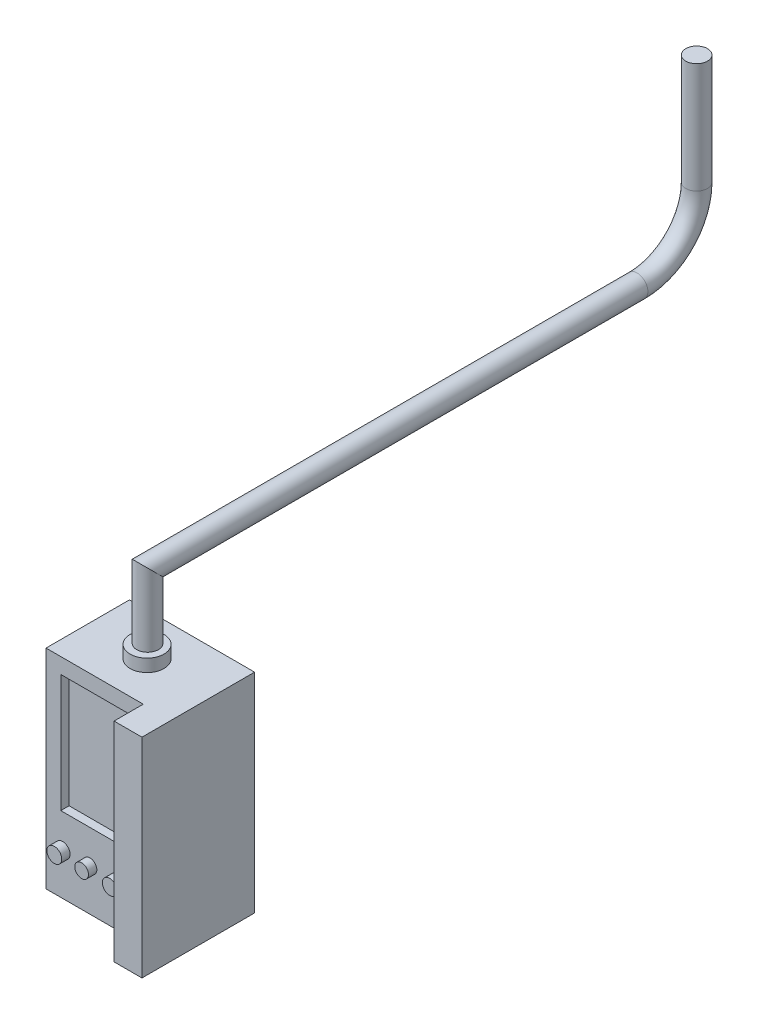
ISO-10303-21;
HEADER;
FILE_DESCRIPTION(('STEP AP214'),'2;1');
FILE_NAME('part.step','',(''),(''),'','','');
FILE_SCHEMA(('AUTOMOTIVE_DESIGN { 1 0 10303 214 1 1 1 1 }'));
ENDSEC;
DATA;
#1=APPLICATION_CONTEXT('core data for automotive mechanical design processes');
#2=APPLICATION_PROTOCOL_DEFINITION('international standard','automotive_design',2000,#1);
#3=PRODUCT_CONTEXT('',#1,'mechanical');
#4=PRODUCT('Part','Part','',(#3));
#5=PRODUCT_RELATED_PRODUCT_CATEGORY('part','',(#4));
#6=PRODUCT_DEFINITION_FORMATION('','',#4);
#7=PRODUCT_DEFINITION_CONTEXT('part definition',#1,'design');
#8=PRODUCT_DEFINITION('design','',#6,#7);
#9=PRODUCT_DEFINITION_SHAPE('','',#8);
#10=(LENGTH_UNIT() NAMED_UNIT(*) SI_UNIT(.MILLI.,.METRE.));
#11=(NAMED_UNIT(*) PLANE_ANGLE_UNIT() SI_UNIT($,.RADIAN.));
#12=(NAMED_UNIT(*) SI_UNIT($,.STERADIAN.) SOLID_ANGLE_UNIT());
#13=UNCERTAINTY_MEASURE_WITH_UNIT(LENGTH_MEASURE(1.E-05),#10,'distance_accuracy_value','');
#14=(GEOMETRIC_REPRESENTATION_CONTEXT(3) GLOBAL_UNCERTAINTY_ASSIGNED_CONTEXT((#13)) GLOBAL_UNIT_ASSIGNED_CONTEXT((#10,
#11,#12)) REPRESENTATION_CONTEXT('',''));
#15=CARTESIAN_POINT('',(0.,0.,0.));
#16=DIRECTION('',(0.,0.,1.));
#17=DIRECTION('',(1.,0.,0.));
#18=AXIS2_PLACEMENT_3D('',#15,#16,#17);
#19=CARTESIAN_POINT('',(-2.79538140352671,33.5591942633084,17.221007175734));
#20=DIRECTION('',(-1.,0.,0.));
#21=DIRECTION('',(0.,-1.,0.));
#22=AXIS2_PLACEMENT_3D('',#19,#20,#21);
#23=PLANE('',#22);
#24=DIRECTION('',(0.,1.,0.));
#25=VECTOR('',#24,1.);
#26=CARTESIAN_POINT('',(-2.79538140352671,33.5591942633084,3.22100717573399));
#27=LINE('',#26,#25);
#28=CARTESIAN_POINT('',(-2.7953814035267,-1.44080573669158,3.22100717573399));
#29=VERTEX_POINT('',#28);
#30=CARTESIAN_POINT('',(-2.79538140352671,33.5591942633084,3.22100717573399));
#31=VERTEX_POINT('',#30);
#32=EDGE_CURVE('E174',#29,#31,#27,.T.);
#33=ORIENTED_EDGE('',*,*,#32,.T.);
#34=DIRECTION('',(0.,0.,-1.));
#35=VECTOR('',#34,1.);
#36=CARTESIAN_POINT('',(-2.79538140352671,33.5591942633084,17.221007175734));
#37=LINE('',#36,#35);
#38=CARTESIAN_POINT('',(-2.79538140352671,33.5591942633084,22.121007175734));
#39=VERTEX_POINT('',#38);
#40=EDGE_CURVE('E46',#39,#31,#37,.T.);
#41=ORIENTED_EDGE('',*,*,#40,.F.);
#42=DIRECTION('',(0.,1.,0.));
#43=VECTOR('',#42,1.);
#44=CARTESIAN_POINT('',(-2.7953814035267,4.80488959279782,22.121007175734));
#45=LINE('',#44,#43);
#46=CARTESIAN_POINT('',(-2.7953814035267,-1.44080573669158,22.121007175734));
#47=VERTEX_POINT('',#46);
#48=EDGE_CURVE('E138',#47,#39,#45,.T.);
#49=ORIENTED_EDGE('',*,*,#48,.F.);
#50=DIRECTION('',(0.,0.,-1.));
#51=VECTOR('',#50,1.);
#52=CARTESIAN_POINT('',(-2.7953814035267,-1.44080573669158,17.221007175734));
#53=LINE('',#52,#51);
#54=EDGE_CURVE('E186',#47,#29,#53,.T.);
#55=ORIENTED_EDGE('',*,*,#54,.T.);
#56=EDGE_LOOP('',(#33,#41,#49,#55));
#57=FACE_BOUND('',#56,.T.);
#58=ADVANCED_FACE('F43',(#57),#23,.F.);
#59=CARTESIAN_POINT('',(-23.7953814035267,33.5591942633084,17.221007175734));
#60=DIRECTION('',(0.,-1.,0.));
#61=DIRECTION('',(0.,0.,-1.));
#62=AXIS2_PLACEMENT_3D('',#59,#60,#61);
#63=PLANE('',#62);
#64=CARTESIAN_POINT('',(-13.767048859401,33.5591942633084,10.2981586443497));
#65=DIRECTION('',(0.,1.,0.));
#66=DIRECTION('',(0.,0.,1.));
#67=AXIS2_PLACEMENT_3D('',#64,#65,#66);
#68=CIRCLE('',#67,2.85205853885435);
#69=CARTESIAN_POINT('',(-13.767048859401,33.5591942633084,13.1502171832041));
#70=VERTEX_POINT('',#69);
#71=EDGE_CURVE('E51',#70,#70,#68,.T.);
#72=ORIENTED_EDGE('',*,*,#71,.F.);
#73=EDGE_LOOP('',(#72));
#74=FACE_BOUND('',#73,.T.);
#75=DIRECTION('',(-1.,0.,0.));
#76=VECTOR('',#75,1.);
#77=CARTESIAN_POINT('',(-23.7953814035267,33.5591942633084,3.22100717573399));
#78=LINE('',#77,#76);
#79=CARTESIAN_POINT('',(-23.7953814035267,33.5591942633084,3.22100717573399));
#80=VERTEX_POINT('',#79);
#81=EDGE_CURVE('E189',#31,#80,#78,.T.);
#82=ORIENTED_EDGE('',*,*,#81,.T.);
#83=DIRECTION('',(0.,0.,-1.));
#84=VECTOR('',#83,1.);
#85=CARTESIAN_POINT('',(-23.7953814035267,33.5591942633084,17.221007175734));
#86=LINE('',#85,#84);
#87=CARTESIAN_POINT('',(-23.7953814035267,33.5591942633084,17.221007175734));
#88=VERTEX_POINT('',#87);
#89=EDGE_CURVE('E198',#88,#80,#86,.T.);
#90=ORIENTED_EDGE('',*,*,#89,.F.);
#91=DIRECTION('',(-1.,0.,0.));
#92=VECTOR('',#91,1.);
#93=CARTESIAN_POINT('',(-23.7953814035267,33.5591942633084,17.221007175734));
#94=LINE('',#93,#92);
#95=CARTESIAN_POINT('',(-7.47893601776985,33.5591942633084,17.221007175734));
#96=VERTEX_POINT('',#95);
#97=EDGE_CURVE('E144',#96,#88,#94,.T.);
#98=ORIENTED_EDGE('',*,*,#97,.F.);
#99=DIRECTION('',(0.,0.,-1.));
#100=VECTOR('',#99,1.);
#101=CARTESIAN_POINT('',(-7.47893601776985,33.5591942633084,22.121007175734));
#102=LINE('',#101,#100);
#103=CARTESIAN_POINT('',(-7.47893601776985,33.5591942633084,22.121007175734));
#104=VERTEX_POINT('',#103);
#105=EDGE_CURVE('E125',#104,#96,#102,.T.);
#106=ORIENTED_EDGE('',*,*,#105,.F.);
#107=DIRECTION('',(-1.,0.,0.));
#108=VECTOR('',#107,1.);
#109=CARTESIAN_POINT('',(-3.79246272769597,33.5591942633084,22.121007175734));
#110=LINE('',#109,#108);
#111=EDGE_CURVE('E132',#39,#104,#110,.T.);
#112=ORIENTED_EDGE('',*,*,#111,.F.);
#113=ORIENTED_EDGE('',*,*,#40,.T.);
#114=EDGE_LOOP('',(#82,#90,#98,#106,#112,#113));
#115=FACE_BOUND('',#114,.T.);
#116=ADVANCED_FACE('F142',(#74,#115),#63,.F.);
#117=CARTESIAN_POINT('',(-23.7953814035267,33.5591942633084,17.221007175734));
#118=DIRECTION('',(1.,0.,0.));
#119=DIRECTION('',(0.,1.,0.));
#120=AXIS2_PLACEMENT_3D('',#117,#118,#119);
#121=PLANE('',#120);
#122=DIRECTION('',(0.,-1.,0.));
#123=VECTOR('',#122,1.);
#124=CARTESIAN_POINT('',(-23.7953814035267,33.5591942633084,3.22100717573399));
#125=LINE('',#124,#123);
#126=CARTESIAN_POINT('',(-23.7953814035267,-1.44080573669158,3.22100717573399));
#127=VERTEX_POINT('',#126);
#128=EDGE_CURVE('E191',#80,#127,#125,.T.);
#129=ORIENTED_EDGE('',*,*,#128,.T.);
#130=DIRECTION('',(0.,0.,-1.));
#131=VECTOR('',#130,1.);
#132=CARTESIAN_POINT('',(-23.7953814035267,-1.44080573669158,17.221007175734));
#133=LINE('',#132,#131);
#134=CARTESIAN_POINT('',(-23.7953814035267,-1.44080573669158,17.221007175734));
#135=VERTEX_POINT('',#134);
#136=EDGE_CURVE('E196',#135,#127,#133,.T.);
#137=ORIENTED_EDGE('',*,*,#136,.F.);
#138=DIRECTION('',(0.,-1.,0.));
#139=VECTOR('',#138,1.);
#140=CARTESIAN_POINT('',(-23.7953814035267,33.5591942633084,17.221007175734));
#141=LINE('',#140,#139);
#142=EDGE_CURVE('E181',#88,#135,#141,.T.);
#143=ORIENTED_EDGE('',*,*,#142,.F.);
#144=ORIENTED_EDGE('',*,*,#89,.T.);
#145=EDGE_LOOP('',(#129,#137,#143,#144));
#146=FACE_BOUND('',#145,.T.);
#147=ADVANCED_FACE('F238',(#146),#121,.F.);
#148=CARTESIAN_POINT('',(-23.7953814035267,-1.44080573669158,17.221007175734));
#149=DIRECTION('',(0.,1.,0.));
#150=DIRECTION('',(0.,0.,1.));
#151=AXIS2_PLACEMENT_3D('',#148,#149,#150);
#152=PLANE('',#151);
#153=DIRECTION('',(1.,0.,0.));
#154=VECTOR('',#153,1.);
#155=CARTESIAN_POINT('',(-23.7953814035267,-1.44080573669158,3.22100717573399));
#156=LINE('',#155,#154);
#157=EDGE_CURVE('E182',#127,#29,#156,.T.);
#158=ORIENTED_EDGE('',*,*,#157,.T.);
#159=ORIENTED_EDGE('',*,*,#54,.F.);
#160=DIRECTION('',(1.,0.,0.));
#161=VECTOR('',#160,1.);
#162=CARTESIAN_POINT('',(-3.79246272769597,-1.44080573669158,22.121007175734));
#163=LINE('',#162,#161);
#164=CARTESIAN_POINT('',(-7.47893601776985,-1.44080573669158,22.121007175734));
#165=VERTEX_POINT('',#164);
#166=EDGE_CURVE('E131',#165,#47,#163,.T.);
#167=ORIENTED_EDGE('',*,*,#166,.F.);
#168=DIRECTION('',(0.,0.,-1.));
#169=VECTOR('',#168,1.);
#170=CARTESIAN_POINT('',(-7.47893601776985,-1.44080573669158,22.121007175734));
#171=LINE('',#170,#169);
#172=CARTESIAN_POINT('',(-7.47893601776985,-1.44080573669158,17.221007175734));
#173=VERTEX_POINT('',#172);
#174=EDGE_CURVE('E127',#165,#173,#171,.T.);
#175=ORIENTED_EDGE('',*,*,#174,.T.);
#176=DIRECTION('',(1.,0.,0.));
#177=VECTOR('',#176,1.);
#178=CARTESIAN_POINT('',(-23.7953814035267,-1.44080573669158,17.221007175734));
#179=LINE('',#178,#177);
#180=EDGE_CURVE('E184',#135,#173,#179,.T.);
#181=ORIENTED_EDGE('',*,*,#180,.F.);
#182=ORIENTED_EDGE('',*,*,#136,.T.);
#183=EDGE_LOOP('',(#158,#159,#167,#175,#181,#182));
#184=FACE_BOUND('',#183,.T.);
#185=ADVANCED_FACE('F231',(#184),#152,.F.);
#186=CARTESIAN_POINT('',(-3.79246272769597,4.80488959279782,17.221007175734));
#187=DIRECTION('',(0.,0.,1.));
#188=DIRECTION('',(1.,0.,0.));
#189=AXIS2_PLACEMENT_3D('',#186,#187,#188);
#190=PLANE('',#189);
#191=CARTESIAN_POINT('',(-11.696623683679,5.59515293267952,17.221007175734));
#192=DIRECTION('',(0.,0.,1.));
#193=DIRECTION('',(1.,0.,0.));
#194=AXIS2_PLACEMENT_3D('',#191,#192,#193);
#195=CIRCLE('',#194,1.2472440046638);
#196=CARTESIAN_POINT('',(-10.4493796790152,5.59515293267952,17.221007175734));
#197=VERTEX_POINT('',#196);
#198=EDGE_CURVE('E214',#197,#197,#195,.T.);
#199=ORIENTED_EDGE('',*,*,#198,.F.);
#200=EDGE_LOOP('',(#199));
#201=FACE_BOUND('',#200,.T.);
#202=CARTESIAN_POINT('',(-16.4216101494022,5.59515293267952,17.221007175734));
#203=DIRECTION('',(0.,0.,1.));
#204=DIRECTION('',(1.,0.,0.));
#205=AXIS2_PLACEMENT_3D('',#202,#203,#204);
#206=CIRCLE('',#205,1.15096971644149);
#207=CARTESIAN_POINT('',(-15.2706404329607,5.59515293267952,17.221007175734));
#208=VERTEX_POINT('',#207);
#209=EDGE_CURVE('E213',#208,#208,#206,.T.);
#210=ORIENTED_EDGE('',*,*,#209,.F.);
#211=EDGE_LOOP('',(#210));
#212=FACE_BOUND('',#211,.T.);
#213=CARTESIAN_POINT('',(-21.0064010664818,5.59515293267952,17.221007175734));
#214=DIRECTION('',(0.,0.,1.));
#215=DIRECTION('',(1.,0.,0.));
#216=AXIS2_PLACEMENT_3D('',#213,#214,#215);
#217=CIRCLE('',#216,1.24837859010856);
#218=CARTESIAN_POINT('',(-19.7580224763732,5.59515293267952,17.221007175734));
#219=VERTEX_POINT('',#218);
#220=EDGE_CURVE('E220',#219,#219,#217,.T.);
#221=ORIENTED_EDGE('',*,*,#220,.F.);
#222=EDGE_LOOP('',(#221));
#223=FACE_BOUND('',#222,.T.);
#224=DIRECTION('',(0.,-1.,0.));
#225=VECTOR('',#224,1.);
#226=CARTESIAN_POINT('',(-7.47893601776985,4.80488959279782,17.221007175734));
#227=LINE('',#226,#225);
#228=EDGE_CURVE('E59',#96,#173,#227,.T.);
#229=ORIENTED_EDGE('',*,*,#228,.F.);
#230=ORIENTED_EDGE('',*,*,#97,.T.);
#231=ORIENTED_EDGE('',*,*,#142,.T.);
#232=ORIENTED_EDGE('',*,*,#180,.T.);
#233=EDGE_LOOP('',(#229,#230,#231,#232));
#234=FACE_BOUND('',#233,.T.);
#235=DIRECTION('',(0.,1.,0.));
#236=VECTOR('',#235,1.);
#237=CARTESIAN_POINT('',(-9.00569416506817,30.9619212226339,17.221007175734));
#238=LINE('',#237,#236);
#239=CARTESIAN_POINT('',(-9.00569416506817,11.171513915197,17.221007175734));
#240=VERTEX_POINT('',#239);
#241=CARTESIAN_POINT('',(-9.00569416506817,30.9619212226339,17.221007175734));
#242=VERTEX_POINT('',#241);
#243=EDGE_CURVE('E67',#240,#242,#238,.T.);
#244=ORIENTED_EDGE('',*,*,#243,.F.);
#245=DIRECTION('',(1.,0.,0.));
#246=VECTOR('',#245,1.);
#247=CARTESIAN_POINT('',(-21.3188164589605,11.171513915197,17.221007175734));
#248=LINE('',#247,#246);
#249=CARTESIAN_POINT('',(-21.3188164589605,11.171513915197,17.221007175734));
#250=VERTEX_POINT('',#249);
#251=EDGE_CURVE('E155',#250,#240,#248,.T.);
#252=ORIENTED_EDGE('',*,*,#251,.F.);
#253=DIRECTION('',(0.,-1.,0.));
#254=VECTOR('',#253,1.);
#255=CARTESIAN_POINT('',(-21.3188164589605,30.9619212226339,17.221007175734));
#256=LINE('',#255,#254);
#257=CARTESIAN_POINT('',(-21.3188164589605,30.9619212226339,17.221007175734));
#258=VERTEX_POINT('',#257);
#259=EDGE_CURVE('E167',#258,#250,#256,.T.);
#260=ORIENTED_EDGE('',*,*,#259,.F.);
#261=DIRECTION('',(-1.,0.,0.));
#262=VECTOR('',#261,1.);
#263=CARTESIAN_POINT('',(-21.3188164589605,30.9619212226339,17.221007175734));
#264=LINE('',#263,#262);
#265=EDGE_CURVE('E146',#242,#258,#264,.T.);
#266=ORIENTED_EDGE('',*,*,#265,.F.);
#267=EDGE_LOOP('',(#244,#252,#260,#266));
#268=FACE_BOUND('',#267,.T.);
#269=ADVANCED_FACE('F239',(#201,#212,#223,#234,#268),#190,.T.);
#270=CARTESIAN_POINT('',(-3.79246272769597,4.80488959279782,3.22100717573399));
#271=DIRECTION('',(0.,0.,1.));
#272=DIRECTION('',(1.,0.,0.));
#273=AXIS2_PLACEMENT_3D('',#270,#271,#272);
#274=PLANE('',#273);
#275=ORIENTED_EDGE('',*,*,#32,.F.);
#276=ORIENTED_EDGE('',*,*,#157,.F.);
#277=ORIENTED_EDGE('',*,*,#128,.F.);
#278=ORIENTED_EDGE('',*,*,#81,.F.);
#279=EDGE_LOOP('',(#275,#276,#277,#278));
#280=FACE_BOUND('',#279,.T.);
#281=ADVANCED_FACE('F236',(#280),#274,.F.);
#282=CARTESIAN_POINT('',(-9.00569416506817,30.9619212226339,15.821007175734));
#283=DIRECTION('',(1.,0.,0.));
#284=DIRECTION('',(0.,0.,-1.));
#285=AXIS2_PLACEMENT_3D('',#282,#283,#284);
#286=PLANE('',#285);
#287=ORIENTED_EDGE('',*,*,#243,.T.);
#288=DIRECTION('',(0.,0.,1.));
#289=VECTOR('',#288,1.);
#290=CARTESIAN_POINT('',(-9.00569416506817,30.9619212226339,15.821007175734));
#291=LINE('',#290,#289);
#292=CARTESIAN_POINT('',(-9.00569416506817,30.9619212226339,15.821007175734));
#293=VERTEX_POINT('',#292);
#294=EDGE_CURVE('E163',#293,#242,#291,.T.);
#295=ORIENTED_EDGE('',*,*,#294,.F.);
#296=DIRECTION('',(0.,1.,0.));
#297=VECTOR('',#296,1.);
#298=CARTESIAN_POINT('',(-9.00569416506817,30.9619212226339,15.821007175734));
#299=LINE('',#298,#297);
#300=CARTESIAN_POINT('',(-9.00569416506817,11.171513915197,15.821007175734));
#301=VERTEX_POINT('',#300);
#302=EDGE_CURVE('E151',#301,#293,#299,.T.);
#303=ORIENTED_EDGE('',*,*,#302,.F.);
#304=DIRECTION('',(0.,0.,1.));
#305=VECTOR('',#304,1.);
#306=CARTESIAN_POINT('',(-9.00569416506817,11.171513915197,15.821007175734));
#307=LINE('',#306,#305);
#308=EDGE_CURVE('E172',#301,#240,#307,.T.);
#309=ORIENTED_EDGE('',*,*,#308,.T.);
#310=EDGE_LOOP('',(#287,#295,#303,#309));
#311=FACE_BOUND('',#310,.T.);
#312=ADVANCED_FACE('F252',(#311),#286,.F.);
#313=CARTESIAN_POINT('',(-21.3188164589605,11.171513915197,15.821007175734));
#314=DIRECTION('',(0.,-1.,0.));
#315=DIRECTION('',(0.,0.,-1.));
#316=AXIS2_PLACEMENT_3D('',#313,#314,#315);
#317=PLANE('',#316);
#318=ORIENTED_EDGE('',*,*,#251,.T.);
#319=ORIENTED_EDGE('',*,*,#308,.F.);
#320=DIRECTION('',(1.,0.,0.));
#321=VECTOR('',#320,1.);
#322=CARTESIAN_POINT('',(-21.3188164589605,11.171513915197,15.821007175734));
#323=LINE('',#322,#321);
#324=CARTESIAN_POINT('',(-21.3188164589605,11.171513915197,15.821007175734));
#325=VERTEX_POINT('',#324);
#326=EDGE_CURVE('E161',#325,#301,#323,.T.);
#327=ORIENTED_EDGE('',*,*,#326,.F.);
#328=DIRECTION('',(0.,0.,1.));
#329=VECTOR('',#328,1.);
#330=CARTESIAN_POINT('',(-21.3188164589605,11.171513915197,15.821007175734));
#331=LINE('',#330,#329);
#332=EDGE_CURVE('E175',#325,#250,#331,.T.);
#333=ORIENTED_EDGE('',*,*,#332,.T.);
#334=EDGE_LOOP('',(#318,#319,#327,#333));
#335=FACE_BOUND('',#334,.T.);
#336=ADVANCED_FACE('F257',(#335),#317,.F.);
#337=CARTESIAN_POINT('',(-21.3188164589605,30.9619212226339,15.821007175734));
#338=DIRECTION('',(-1.,0.,0.));
#339=DIRECTION('',(0.,0.,1.));
#340=AXIS2_PLACEMENT_3D('',#337,#338,#339);
#341=PLANE('',#340);
#342=ORIENTED_EDGE('',*,*,#259,.T.);
#343=ORIENTED_EDGE('',*,*,#332,.F.);
#344=DIRECTION('',(0.,-1.,0.));
#345=VECTOR('',#344,1.);
#346=CARTESIAN_POINT('',(-21.3188164589605,30.9619212226339,15.821007175734));
#347=LINE('',#346,#345);
#348=CARTESIAN_POINT('',(-21.3188164589605,30.9619212226339,15.821007175734));
#349=VERTEX_POINT('',#348);
#350=EDGE_CURVE('E158',#349,#325,#347,.T.);
#351=ORIENTED_EDGE('',*,*,#350,.F.);
#352=DIRECTION('',(0.,0.,1.));
#353=VECTOR('',#352,1.);
#354=CARTESIAN_POINT('',(-21.3188164589605,30.9619212226339,15.821007175734));
#355=LINE('',#354,#353);
#356=EDGE_CURVE('E177',#349,#258,#355,.T.);
#357=ORIENTED_EDGE('',*,*,#356,.T.);
#358=EDGE_LOOP('',(#342,#343,#351,#357));
#359=FACE_BOUND('',#358,.T.);
#360=ADVANCED_FACE('F259',(#359),#341,.F.);
#361=CARTESIAN_POINT('',(-21.3188164589605,30.9619212226339,15.821007175734));
#362=DIRECTION('',(0.,1.,0.));
#363=DIRECTION('',(0.,0.,1.));
#364=AXIS2_PLACEMENT_3D('',#361,#362,#363);
#365=PLANE('',#364);
#366=ORIENTED_EDGE('',*,*,#265,.T.);
#367=ORIENTED_EDGE('',*,*,#356,.F.);
#368=DIRECTION('',(-1.,0.,0.));
#369=VECTOR('',#368,1.);
#370=CARTESIAN_POINT('',(-21.3188164589605,30.9619212226339,15.821007175734));
#371=LINE('',#370,#369);
#372=EDGE_CURVE('E154',#293,#349,#371,.T.);
#373=ORIENTED_EDGE('',*,*,#372,.F.);
#374=ORIENTED_EDGE('',*,*,#294,.T.);
#375=EDGE_LOOP('',(#366,#367,#373,#374));
#376=FACE_BOUND('',#375,.T.);
#377=ADVANCED_FACE('F248',(#376),#365,.F.);
#378=CARTESIAN_POINT('',(-3.79246272769597,4.80488959279782,15.821007175734));
#379=DIRECTION('',(0.,0.,1.));
#380=DIRECTION('',(1.,0.,0.));
#381=AXIS2_PLACEMENT_3D('',#378,#379,#380);
#382=PLANE('',#381);
#383=ORIENTED_EDGE('',*,*,#302,.T.);
#384=ORIENTED_EDGE('',*,*,#372,.T.);
#385=ORIENTED_EDGE('',*,*,#350,.T.);
#386=ORIENTED_EDGE('',*,*,#326,.T.);
#387=EDGE_LOOP('',(#383,#384,#385,#386));
#388=FACE_BOUND('',#387,.T.);
#389=ADVANCED_FACE('F255',(#388),#382,.T.);
#390=CARTESIAN_POINT('',(-7.47893601776985,4.80488959279782,22.121007175734));
#391=DIRECTION('',(1.,0.,0.));
#392=DIRECTION('',(0.,1.,0.));
#393=AXIS2_PLACEMENT_3D('',#390,#391,#392);
#394=PLANE('',#393);
#395=ORIENTED_EDGE('',*,*,#228,.T.);
#396=ORIENTED_EDGE('',*,*,#174,.F.);
#397=DIRECTION('',(0.,-1.,0.));
#398=VECTOR('',#397,1.);
#399=CARTESIAN_POINT('',(-7.47893601776985,4.80488959279782,22.121007175734));
#400=LINE('',#399,#398);
#401=EDGE_CURVE('E121',#104,#165,#400,.T.);
#402=ORIENTED_EDGE('',*,*,#401,.F.);
#403=ORIENTED_EDGE('',*,*,#105,.T.);
#404=EDGE_LOOP('',(#395,#396,#402,#403));
#405=FACE_BOUND('',#404,.T.);
#406=ADVANCED_FACE('F123',(#405),#394,.F.);
#407=CARTESIAN_POINT('',(-3.79246272769597,4.80488959279782,22.121007175734));
#408=DIRECTION('',(0.,0.,1.));
#409=DIRECTION('',(1.,0.,0.));
#410=AXIS2_PLACEMENT_3D('',#407,#408,#409);
#411=PLANE('',#410);
#412=ORIENTED_EDGE('',*,*,#111,.T.);
#413=ORIENTED_EDGE('',*,*,#401,.T.);
#414=ORIENTED_EDGE('',*,*,#166,.T.);
#415=ORIENTED_EDGE('',*,*,#48,.T.);
#416=EDGE_LOOP('',(#412,#413,#414,#415));
#417=FACE_BOUND('',#416,.T.);
#418=ADVANCED_FACE('F136',(#417),#411,.T.);
#419=CARTESIAN_POINT('',(-21.0064010664818,5.59515293267952,18.621007175734));
#420=DIRECTION('',(0.,0.,-1.));
#421=DIRECTION('',(-1.,0.,0.));
#422=AXIS2_PLACEMENT_3D('',#419,#420,#421);
#423=CYLINDRICAL_SURFACE('',#422,1.24837859010856);
#424=CARTESIAN_POINT('',(-21.0064010664818,5.59515293267952,18.621007175734));
#425=DIRECTION('',(0.,0.,1.));
#426=DIRECTION('',(1.,0.,0.));
#427=AXIS2_PLACEMENT_3D('',#424,#425,#426);
#428=CIRCLE('',#427,1.24837859010856);
#429=CARTESIAN_POINT('',(-19.7580224763732,5.59515293267952,18.621007175734));
#430=VERTEX_POINT('',#429);
#431=EDGE_CURVE('E223',#430,#430,#428,.T.);
#432=ORIENTED_EDGE('',*,*,#431,.F.);
#433=EDGE_LOOP('',(#432));
#434=FACE_BOUND('',#433,.T.);
#435=ORIENTED_EDGE('',*,*,#220,.T.);
#436=EDGE_LOOP('',(#435));
#437=FACE_BOUND('',#436,.T.);
#438=ADVANCED_FACE('F328',(#434,#437),#423,.T.);
#439=CARTESIAN_POINT('',(-21.0064010664818,5.59515293267952,18.621007175734));
#440=DIRECTION('',(0.,0.,1.));
#441=DIRECTION('',(1.,0.,0.));
#442=AXIS2_PLACEMENT_3D('',#439,#440,#441);
#443=PLANE('',#442);
#444=ORIENTED_EDGE('',*,*,#431,.T.);
#445=EDGE_LOOP('',(#444));
#446=FACE_BOUND('',#445,.T.);
#447=ADVANCED_FACE('F337',(#446),#443,.T.);
#448=CARTESIAN_POINT('',(-16.4216101494022,5.59515293267952,18.621007175734));
#449=DIRECTION('',(0.,0.,-1.));
#450=DIRECTION('',(-1.,0.,0.));
#451=AXIS2_PLACEMENT_3D('',#448,#449,#450);
#452=CYLINDRICAL_SURFACE('',#451,1.15096971644149);
#453=CARTESIAN_POINT('',(-16.4216101494022,5.59515293267952,18.621007175734));
#454=DIRECTION('',(0.,0.,1.));
#455=DIRECTION('',(1.,0.,0.));
#456=AXIS2_PLACEMENT_3D('',#453,#454,#455);
#457=CIRCLE('',#456,1.15096971644149);
#458=CARTESIAN_POINT('',(-15.2706404329607,5.59515293267952,18.621007175734));
#459=VERTEX_POINT('',#458);
#460=EDGE_CURVE('E217',#459,#459,#457,.T.);
#461=ORIENTED_EDGE('',*,*,#460,.F.);
#462=EDGE_LOOP('',(#461));
#463=FACE_BOUND('',#462,.T.);
#464=ORIENTED_EDGE('',*,*,#209,.T.);
#465=EDGE_LOOP('',(#464));
#466=FACE_BOUND('',#465,.T.);
#467=ADVANCED_FACE('F348',(#463,#466),#452,.T.);
#468=CARTESIAN_POINT('',(-16.4216101494022,5.59515293267952,18.621007175734));
#469=DIRECTION('',(0.,0.,1.));
#470=DIRECTION('',(1.,0.,0.));
#471=AXIS2_PLACEMENT_3D('',#468,#469,#470);
#472=PLANE('',#471);
#473=ORIENTED_EDGE('',*,*,#460,.T.);
#474=EDGE_LOOP('',(#473));
#475=FACE_BOUND('',#474,.T.);
#476=ADVANCED_FACE('F358',(#475),#472,.T.);
#477=CARTESIAN_POINT('',(-11.696623683679,5.59515293267952,18.621007175734));
#478=DIRECTION('',(0.,0.,-1.));
#479=DIRECTION('',(-1.,0.,0.));
#480=AXIS2_PLACEMENT_3D('',#477,#478,#479);
#481=CYLINDRICAL_SURFACE('',#480,1.2472440046638);
#482=CARTESIAN_POINT('',(-11.696623683679,5.59515293267952,18.621007175734));
#483=DIRECTION('',(0.,0.,1.));
#484=DIRECTION('',(1.,0.,0.));
#485=AXIS2_PLACEMENT_3D('',#482,#483,#484);
#486=CIRCLE('',#485,1.2472440046638);
#487=CARTESIAN_POINT('',(-10.4493796790152,5.59515293267952,18.621007175734));
#488=VERTEX_POINT('',#487);
#489=EDGE_CURVE('E210',#488,#488,#486,.T.);
#490=ORIENTED_EDGE('',*,*,#489,.F.);
#491=EDGE_LOOP('',(#490));
#492=FACE_BOUND('',#491,.T.);
#493=ORIENTED_EDGE('',*,*,#198,.T.);
#494=EDGE_LOOP('',(#493));
#495=FACE_BOUND('',#494,.T.);
#496=ADVANCED_FACE('F368',(#492,#495),#481,.T.);
#497=CARTESIAN_POINT('',(-11.696623683679,5.59515293267952,18.621007175734));
#498=DIRECTION('',(0.,0.,1.));
#499=DIRECTION('',(1.,0.,0.));
#500=AXIS2_PLACEMENT_3D('',#497,#498,#499);
#501=PLANE('',#500);
#502=ORIENTED_EDGE('',*,*,#489,.T.);
#503=EDGE_LOOP('',(#502));
#504=FACE_BOUND('',#503,.T.);
#505=ADVANCED_FACE('F377',(#504),#501,.T.);
#506=CARTESIAN_POINT('',(-13.767048859401,35.6591942633084,10.2981586443497));
#507=DIRECTION('',(0.,-1.,0.));
#508=DIRECTION('',(0.,0.,-1.));
#509=AXIS2_PLACEMENT_3D('',#506,#507,#508);
#510=CYLINDRICAL_SURFACE('',#509,2.85205853885435);
#511=CARTESIAN_POINT('',(-13.767048859401,35.6591942633084,10.2981586443497));
#512=DIRECTION('',(0.,1.,0.));
#513=DIRECTION('',(0.,0.,1.));
#514=AXIS2_PLACEMENT_3D('',#511,#512,#513);
#515=CIRCLE('',#514,2.85205853885435);
#516=CARTESIAN_POINT('',(-13.767048859401,35.6591942633084,13.1502171832041));
#517=VERTEX_POINT('',#516);
#518=EDGE_CURVE('E209',#517,#517,#515,.T.);
#519=ORIENTED_EDGE('',*,*,#518,.F.);
#520=EDGE_LOOP('',(#519));
#521=FACE_BOUND('',#520,.T.);
#522=ORIENTED_EDGE('',*,*,#71,.T.);
#523=EDGE_LOOP('',(#522));
#524=FACE_BOUND('',#523,.T.);
#525=ADVANCED_FACE('F387',(#521,#524),#510,.T.);
#526=CARTESIAN_POINT('',(-13.767048859401,35.6591942633084,10.2981586443497));
#527=DIRECTION('',(0.,1.,0.));
#528=DIRECTION('',(0.,0.,1.));
#529=AXIS2_PLACEMENT_3D('',#526,#527,#528);
#530=PLANE('',#529);
#531=CARTESIAN_POINT('',(-13.8479032543169,35.6591942633084,10.1286381127529));
#532=DIRECTION('',(0.,1.,0.));
#533=DIRECTION('',(0.,0.,1.));
#534=AXIS2_PLACEMENT_3D('',#531,#532,#533);
#535=CIRCLE('',#534,1.82119356321451);
#536=CARTESIAN_POINT('',(-13.8479032543169,35.6591942633084,11.9498316759674));
#537=VERTEX_POINT('',#536);
#538=EDGE_CURVE('E12',#537,#537,#535,.T.);
#539=ORIENTED_EDGE('',*,*,#538,.F.);
#540=EDGE_LOOP('',(#539));
#541=FACE_BOUND('',#540,.T.);
#542=ORIENTED_EDGE('',*,*,#518,.T.);
#543=EDGE_LOOP('',(#542));
#544=FACE_BOUND('',#543,.T.);
#545=ADVANCED_FACE('F396',(#541,#544),#530,.T.);
#546=CARTESIAN_POINT('',(-13.8479032543169,37.7591942633084,10.1286381127529));
#547=DIRECTION('',(0.,-1.,0.));
#548=DIRECTION('',(0.,0.,-1.));
#549=AXIS2_PLACEMENT_3D('',#546,#547,#548);
#550=CYLINDRICAL_SURFACE('',#549,1.82119356321451);
#551=ORIENTED_EDGE('',*,*,#538,.T.);
#552=EDGE_LOOP('',(#551));
#553=FACE_BOUND('',#552,.T.);
#554=CARTESIAN_POINT('',(-13.8479032543169,46.6125752965962,10.1286381127529));
#555=DIRECTION('',(0.,0.707106781186547,-0.707106781186548));
#556=DIRECTION('',(0.,0.707106781186548,0.707106781186547));
#557=AXIS2_PLACEMENT_3D('',#554,#555,#556);
#558=ELLIPSE('',#557,2.57555663680454,1.82119356321451);
#559=CARTESIAN_POINT('',(-13.8479032543169,48.4337688598107,11.9498316759674));
#560=VERTEX_POINT('',#559);
#561=EDGE_CURVE('E471',#560,#560,#558,.F.);
#562=ORIENTED_EDGE('',*,*,#561,.T.);
#563=EDGE_LOOP('',(#562));
#564=FACE_BOUND('',#563,.T.);
#565=ADVANCED_FACE('F406',(#553,#564),#550,.T.);
#566=CARTESIAN_POINT('',(-13.8479032543168,75.1219160341456,-82.0075107226519));
#567=DIRECTION('',(0.,1.,0.));
#568=DIRECTION('',(0.,0.,1.));
#569=AXIS2_PLACEMENT_3D('',#566,#567,#568);
#570=PLANE('',#569);
#571=CARTESIAN_POINT('',(-13.8479032543168,75.1219160341456,-82.0075107226519));
#572=DIRECTION('',(0.,1.,0.));
#573=DIRECTION('',(0.,0.,1.));
#574=AXIS2_PLACEMENT_3D('',#571,#572,#573);
#575=CIRCLE('',#574,1.82119356321451);
#576=CARTESIAN_POINT('',(-13.8479032543168,75.1219160341456,-80.1863171594374));
#577=VERTEX_POINT('',#576);
#578=EDGE_CURVE('E464',#577,#577,#575,.T.);
#579=ORIENTED_EDGE('',*,*,#578,.T.);
#580=EDGE_LOOP('',(#579));
#581=FACE_BOUND('',#580,.T.);
#582=ADVANCED_FACE('F417',(#581),#570,.T.);
#583=CARTESIAN_POINT('',(-13.8479032543169,46.6125752965962,12.2319510322888));
#584=DIRECTION('',(0.,0.,-1.));
#585=DIRECTION('',(0.,1.,0.));
#586=AXIS2_PLACEMENT_3D('',#583,#584,#585);
#587=CYLINDRICAL_SURFACE('',#586,1.82119356321451);
#588=ORIENTED_EDGE('',*,*,#561,.F.);
#589=EDGE_LOOP('',(#588));
#590=FACE_BOUND('',#589,.T.);
#591=CARTESIAN_POINT('',(-13.8479032543168,46.6125752965962,-72.0075107226519));
#592=DIRECTION('',(0.,0.,-1.));
#593=DIRECTION('',(0.,1.,0.));
#594=AXIS2_PLACEMENT_3D('',#591,#592,#593);
#595=CIRCLE('',#594,1.82119356321451);
#596=CARTESIAN_POINT('',(-13.8479032543168,44.7913817333817,-72.0075107226519));
#597=VERTEX_POINT('',#596);
#598=EDGE_CURVE('E468',#597,#597,#595,.T.);
#599=ORIENTED_EDGE('',*,*,#598,.F.);
#600=EDGE_LOOP('',(#599));
#601=FACE_BOUND('',#600,.T.);
#602=ADVANCED_FACE('F428',(#590,#601),#587,.T.);
#603=CARTESIAN_POINT('',(-13.8479032543169,56.6125752965962,-72.0075107226519));
#604=DIRECTION('',(1.,0.,0.));
#605=DIRECTION('',(0.,0.,-1.));
#606=AXIS2_PLACEMENT_3D('',#603,#604,#605);
#607=TOROIDAL_SURFACE('',#606,10.,1.82119356321451);
#608=CARTESIAN_POINT('',(-13.8479032543168,56.6125752965962,-82.0075107226519));
#609=DIRECTION('',(0.,1.,0.));
#610=DIRECTION('',(0.,0.,1.));
#611=AXIS2_PLACEMENT_3D('',#608,#609,#610);
#612=CIRCLE('',#611,1.82119356321451);
#613=CARTESIAN_POINT('',(-13.8479032543168,56.6125752965962,-83.8287042858665));
#614=VERTEX_POINT('',#613);
#615=EDGE_CURVE('E467',#614,#614,#612,.T.);
#616=CARTESIAN_POINT('',(-13.8479032543169,56.6125752965962,-72.0075107226519));
#617=DIRECTION('',(1.,0.,0.));
#618=DIRECTION('',(0.,0.,-1.));
#619=AXIS2_PLACEMENT_3D('',#616,#617,#618);
#620=CIRCLE('',#619,11.8211935632145);
#621=EDGE_CURVE('',#597,#614,#620,.T.);
#622=ORIENTED_EDGE('',*,*,#598,.T.);
#623=ORIENTED_EDGE('',*,*,#615,.F.);
#624=ORIENTED_EDGE('',*,*,#621,.T.);
#625=ORIENTED_EDGE('',*,*,#621,.F.);
#626=EDGE_LOOP('',(#622,#624,#623,#625));
#627=FACE_BOUND('',#626,.T.);
#628=ADVANCED_FACE('F438',(#627),#607,.T.);
#629=CARTESIAN_POINT('',(-13.8479032543168,56.6125752965962,-82.0075107226519));
#630=DIRECTION('',(0.,1.,0.));
#631=DIRECTION('',(0.,0.,1.));
#632=AXIS2_PLACEMENT_3D('',#629,#630,#631);
#633=CYLINDRICAL_SURFACE('',#632,1.82119356321451);
#634=ORIENTED_EDGE('',*,*,#578,.F.);
#635=EDGE_LOOP('',(#634));
#636=FACE_BOUND('',#635,.T.);
#637=ORIENTED_EDGE('',*,*,#615,.T.);
#638=EDGE_LOOP('',(#637));
#639=FACE_BOUND('',#638,.T.);
#640=ADVANCED_FACE('F420',(#636,#639),#633,.T.);
#641=CLOSED_SHELL('',(#58,#116,#147,#185,#269,#281,#312,#336,#360,#377,#389,#406,#418,#438,#447,
#467,#476,#496,#505,#525,#545,#565,#582,#602,#628,#640));
#642=MANIFOLD_SOLID_BREP('B2',#641);
#643=ADVANCED_BREP_SHAPE_REPRESENTATION('',(#18,#642),#14);
#644=SHAPE_DEFINITION_REPRESENTATION(#9,#643);
ENDSEC;
END-ISO-10303-21;
